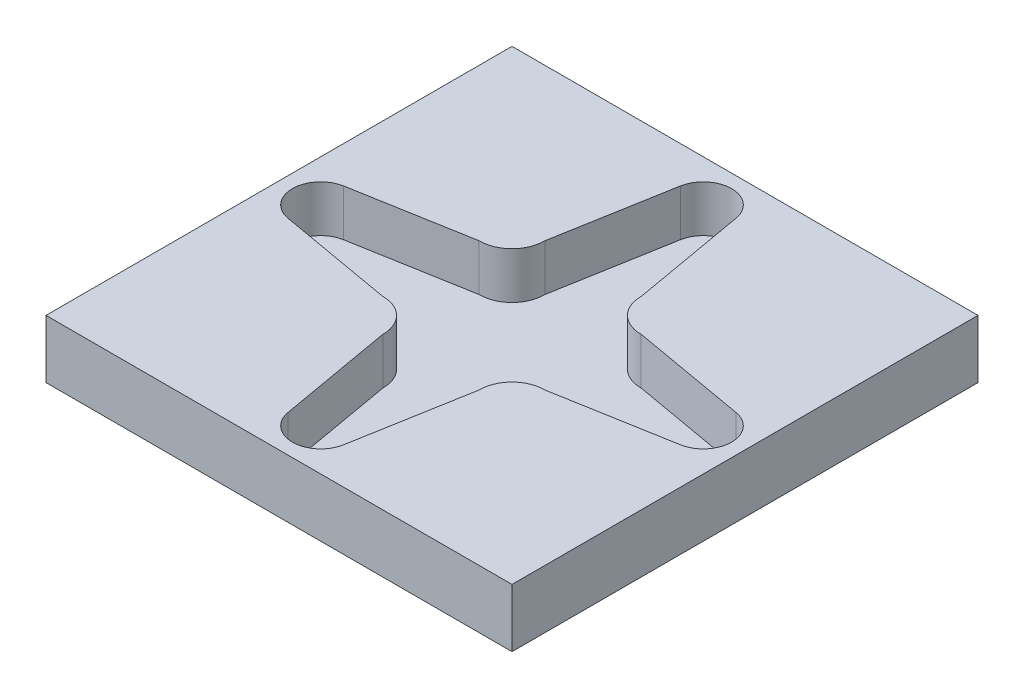
ISO-10303-21;
HEADER;
FILE_DESCRIPTION(('STEP AP214'),'2;1');
FILE_NAME('part.step','',(''),(''),'','','');
FILE_SCHEMA(('AUTOMOTIVE_DESIGN { 1 0 10303 214 1 1 1 1 }'));
ENDSEC;
DATA;
#1=APPLICATION_CONTEXT('core data for automotive mechanical design processes');
#2=APPLICATION_PROTOCOL_DEFINITION('international standard','automotive_design',2000,#1);
#3=PRODUCT_CONTEXT('',#1,'mechanical');
#4=PRODUCT('Part','Part','',(#3));
#5=PRODUCT_RELATED_PRODUCT_CATEGORY('part','',(#4));
#6=PRODUCT_DEFINITION_FORMATION('','',#4);
#7=PRODUCT_DEFINITION_CONTEXT('part definition',#1,'design');
#8=PRODUCT_DEFINITION('design','',#6,#7);
#9=PRODUCT_DEFINITION_SHAPE('','',#8);
#10=(LENGTH_UNIT() NAMED_UNIT(*) SI_UNIT(.MILLI.,.METRE.));
#11=(NAMED_UNIT(*) PLANE_ANGLE_UNIT() SI_UNIT($,.RADIAN.));
#12=(NAMED_UNIT(*) SI_UNIT($,.STERADIAN.) SOLID_ANGLE_UNIT());
#13=UNCERTAINTY_MEASURE_WITH_UNIT(LENGTH_MEASURE(1.E-05),#10,'distance_accuracy_value','');
#14=(GEOMETRIC_REPRESENTATION_CONTEXT(3) GLOBAL_UNCERTAINTY_ASSIGNED_CONTEXT((#13)) GLOBAL_UNIT_ASSIGNED_CONTEXT((#10,
#11,#12)) REPRESENTATION_CONTEXT('',''));
#15=CARTESIAN_POINT('',(0.,0.,0.));
#16=DIRECTION('',(0.,0.,1.));
#17=DIRECTION('',(1.,0.,0.));
#18=AXIS2_PLACEMENT_3D('',#15,#16,#17);
#19=CARTESIAN_POINT('',(0.,5.,0.));
#20=DIRECTION('',(0.,1.,0.));
#21=DIRECTION('',(0.,0.,1.));
#22=AXIS2_PLACEMENT_3D('',#19,#20,#21);
#23=PLANE('',#22);
#24=DIRECTION('',(-0.984807753012208,0.,0.173648177666932));
#25=VECTOR('',#24,1.);
#26=CARTESIAN_POINT('',(-6.95755421826345,5.,-4.13668710144533));
#27=LINE('',#26,#25);
#28=CARTESIAN_POINT('',(-6.95755421826345,5.00000000000001,-4.13668710144533));
#29=VERTEX_POINT('',#28);
#30=CARTESIAN_POINT('',(-16.8412600087122,5.00000000000001,-2.39392310120471));
#31=VERTEX_POINT('',#30);
#32=EDGE_CURVE('E300',#29,#31,#27,.T.);
#33=ORIENTED_EDGE('',*,*,#32,.F.);
#34=CARTESIAN_POINT('',(-6.92372320752341,5.,-6.92372320752326));
#35=DIRECTION('',(0.,1.,0.));
#36=DIRECTION('',(0.,0.,1.));
#37=AXIS2_PLACEMENT_3D('',#34,#35,#36);
#38=CIRCLE('',#37,2.78724143085412);
#39=CARTESIAN_POINT('',(-4.13668710144548,5.,-6.95755421826329));
#40=VERTEX_POINT('',#39);
#41=EDGE_CURVE('E303',#40,#29,#38,.F.);
#42=ORIENTED_EDGE('',*,*,#41,.F.);
#43=DIRECTION('',(-0.173648177666917,0.,0.98480775301221));
#44=VECTOR('',#43,1.);
#45=CARTESIAN_POINT('',(-2.393923101205,5.,-16.8412600087122));
#46=LINE('',#45,#44);
#47=CARTESIAN_POINT('',(-2.393923101205,5.,-16.8412600087122));
#48=VERTEX_POINT('',#47);
#49=EDGE_CURVE('E200',#48,#40,#46,.T.);
#50=ORIENTED_EDGE('',*,*,#49,.F.);
#51=CARTESIAN_POINT('',(-1.10097060438939E-13,5.,-16.4191467762285));
#52=DIRECTION('',(0.,1.,0.));
#53=DIRECTION('',(0.,0.,1.));
#54=AXIS2_PLACEMENT_3D('',#51,#52,#53);
#55=CIRCLE('',#54,2.43085322377149);
#56=CARTESIAN_POINT('',(2.39392310120477,5.00000000000001,-16.8412600087122));
#57=VERTEX_POINT('',#56);
#58=EDGE_CURVE('E261',#57,#48,#55,.T.);
#59=ORIENTED_EDGE('',*,*,#58,.F.);
#60=DIRECTION('',(-0.173648177666929,0.,-0.984807753012208));
#61=VECTOR('',#60,1.);
#62=CARTESIAN_POINT('',(4.13668710144536,5.,-6.95755421826344));
#63=LINE('',#62,#61);
#64=CARTESIAN_POINT('',(4.13668710144536,5.00000000000001,-6.95755421826344));
#65=VERTEX_POINT('',#64);
#66=EDGE_CURVE('E264',#65,#57,#63,.T.);
#67=ORIENTED_EDGE('',*,*,#66,.F.);
#68=CARTESIAN_POINT('',(6.92372320752328,5.,-6.92372320752338));
#69=DIRECTION('',(0.,1.,0.));
#70=DIRECTION('',(0.,0.,1.));
#71=AXIS2_PLACEMENT_3D('',#68,#69,#70);
#72=CIRCLE('',#71,2.78724143085411);
#73=CARTESIAN_POINT('',(6.95755421826331,5.00000000000001,-4.13668710144546));
#74=VERTEX_POINT('',#73);
#75=EDGE_CURVE('E267',#74,#65,#72,.F.);
#76=ORIENTED_EDGE('',*,*,#75,.F.);
#77=DIRECTION('',(-0.98480775301221,0.,-0.173648177666921));
#78=VECTOR('',#77,1.);
#79=CARTESIAN_POINT('',(16.8412600087122,5.,-2.39392310120494));
#80=LINE('',#79,#78);
#81=CARTESIAN_POINT('',(16.8412600087122,5.00000000000001,-2.39392310120494));
#82=VERTEX_POINT('',#81);
#83=EDGE_CURVE('E270',#82,#74,#80,.T.);
#84=ORIENTED_EDGE('',*,*,#83,.F.);
#85=CARTESIAN_POINT('',(16.4191467762285,5.,0.));
#86=DIRECTION('',(0.,1.,0.));
#87=DIRECTION('',(0.,0.,1.));
#88=AXIS2_PLACEMENT_3D('',#85,#86,#87);
#89=CIRCLE('',#88,2.43085322377149);
#90=CARTESIAN_POINT('',(16.8412600087122,5.00000000000001,2.39392310120483));
#91=VERTEX_POINT('',#90);
#92=EDGE_CURVE('E273',#91,#82,#89,.T.);
#93=ORIENTED_EDGE('',*,*,#92,.F.);
#94=DIRECTION('',(0.984807753012209,0.,-0.173648177666925));
#95=VECTOR('',#94,1.);
#96=CARTESIAN_POINT('',(6.95755421826342,5.,4.13668710144538));
#97=LINE('',#96,#95);
#98=CARTESIAN_POINT('',(6.95755421826343,5.00000000000001,4.13668710144538));
#99=VERTEX_POINT('',#98);
#100=EDGE_CURVE('E276',#99,#91,#97,.T.);
#101=ORIENTED_EDGE('',*,*,#100,.F.);
#102=CARTESIAN_POINT('',(6.92372320752336,5.,6.9237232075233));
#103=DIRECTION('',(0.,1.,0.));
#104=DIRECTION('',(0.,0.,1.));
#105=AXIS2_PLACEMENT_3D('',#102,#103,#104);
#106=CIRCLE('',#105,2.78724143085411);
#107=CARTESIAN_POINT('',(4.13668710144543,5.00000000000001,6.95755421826332));
#108=VERTEX_POINT('',#107);
#109=EDGE_CURVE('E279',#108,#99,#106,.F.);
#110=ORIENTED_EDGE('',*,*,#109,.F.);
#111=DIRECTION('',(0.173648177666924,0.,-0.984807753012209));
#112=VECTOR('',#111,1.);
#113=CARTESIAN_POINT('',(2.39392310120488,5.,16.8412600087122));
#114=LINE('',#113,#112);
#115=CARTESIAN_POINT('',(2.39392310120488,5.00000000000001,16.8412600087122));
#116=VERTEX_POINT('',#115);
#117=EDGE_CURVE('E282',#116,#108,#114,.T.);
#118=ORIENTED_EDGE('',*,*,#117,.F.);
#119=CARTESIAN_POINT('',(0.,5.,16.4191467762285));
#120=DIRECTION('',(0.,1.,0.));
#121=DIRECTION('',(0.,0.,1.));
#122=AXIS2_PLACEMENT_3D('',#119,#120,#121);
#123=CIRCLE('',#122,2.43085322377149);
#124=CARTESIAN_POINT('',(-2.39392310120489,5.00000000000001,16.8412600087122));
#125=VERTEX_POINT('',#124);
#126=EDGE_CURVE('E285',#125,#116,#123,.T.);
#127=ORIENTED_EDGE('',*,*,#126,.F.);
#128=DIRECTION('',(0.173648177666926,0.,0.984807753012209));
#129=VECTOR('',#128,1.);
#130=CARTESIAN_POINT('',(-4.13668710144547,5.,6.95755421826328));
#131=LINE('',#130,#129);
#132=CARTESIAN_POINT('',(-4.13668710144547,5.00000000000001,6.95755421826328));
#133=VERTEX_POINT('',#132);
#134=EDGE_CURVE('E288',#133,#125,#131,.T.);
#135=ORIENTED_EDGE('',*,*,#134,.F.);
#136=CARTESIAN_POINT('',(-6.92372320752333,5.,6.92372320752333));
#137=DIRECTION('',(0.,1.,0.));
#138=DIRECTION('',(0.,0.,1.));
#139=AXIS2_PLACEMENT_3D('',#136,#137,#138);
#140=CIRCLE('',#139,2.78724143085404);
#141=CARTESIAN_POINT('',(-6.95755421826341,5.00000000000001,4.13668710144548));
#142=VERTEX_POINT('',#141);
#143=EDGE_CURVE('E291',#142,#133,#140,.F.);
#144=ORIENTED_EDGE('',*,*,#143,.F.);
#145=DIRECTION('',(0.984807753012211,0.,0.173648177666914));
#146=VECTOR('',#145,1.);
#147=CARTESIAN_POINT('',(-16.8412600087122,5.,2.39392310120506));
#148=LINE('',#147,#146);
#149=CARTESIAN_POINT('',(-16.8412600087122,5.00000000000001,2.39392310120506));
#150=VERTEX_POINT('',#149);
#151=EDGE_CURVE('E294',#150,#142,#148,.T.);
#152=ORIENTED_EDGE('',*,*,#151,.F.);
#153=CARTESIAN_POINT('',(-16.4191467762285,5.,1.66737345962402E-13));
#154=DIRECTION('',(0.,1.,0.));
#155=DIRECTION('',(0.,0.,1.));
#156=AXIS2_PLACEMENT_3D('',#153,#154,#155);
#157=CIRCLE('',#156,2.43085322377149);
#158=EDGE_CURVE('E297',#31,#150,#157,.T.);
#159=ORIENTED_EDGE('',*,*,#158,.F.);
#160=EDGE_LOOP('',(#33,#42,#50,#59,#67,#76,#84,#93,#101,#110,#118,#127,#135,#144,#152,#159));
#161=FACE_BOUND('',#160,.T.);
#162=DIRECTION('',(1.,0.,0.));
#163=VECTOR('',#162,1.);
#164=CARTESIAN_POINT('',(-20.,5.,20.));
#165=LINE('',#164,#163);
#166=CARTESIAN_POINT('',(-20.,5.,20.));
#167=VERTEX_POINT('',#166);
#168=CARTESIAN_POINT('',(20.,5.,20.));
#169=VERTEX_POINT('',#168);
#170=EDGE_CURVE('E179',#167,#169,#165,.T.);
#171=ORIENTED_EDGE('',*,*,#170,.T.);
#172=DIRECTION('',(0.,0.,-1.));
#173=VECTOR('',#172,1.);
#174=CARTESIAN_POINT('',(20.,5.,20.));
#175=LINE('',#174,#173);
#176=CARTESIAN_POINT('',(20.,5.,-20.));
#177=VERTEX_POINT('',#176);
#178=EDGE_CURVE('E189',#169,#177,#175,.T.);
#179=ORIENTED_EDGE('',*,*,#178,.T.);
#180=DIRECTION('',(-1.,0.,0.));
#181=VECTOR('',#180,1.);
#182=CARTESIAN_POINT('',(-20.,5.,-20.));
#183=LINE('',#182,#181);
#184=CARTESIAN_POINT('',(-20.,5.,-20.));
#185=VERTEX_POINT('',#184);
#186=EDGE_CURVE('E187',#177,#185,#183,.T.);
#187=ORIENTED_EDGE('',*,*,#186,.T.);
#188=DIRECTION('',(0.,0.,1.));
#189=VECTOR('',#188,1.);
#190=CARTESIAN_POINT('',(-20.,5.,20.));
#191=LINE('',#190,#189);
#192=EDGE_CURVE('E48',#185,#167,#191,.T.);
#193=ORIENTED_EDGE('',*,*,#192,.T.);
#194=EDGE_LOOP('',(#171,#179,#187,#193));
#195=FACE_BOUND('',#194,.T.);
#196=ADVANCED_FACE('F33',(#161,#195),#23,.T.);
#197=CARTESIAN_POINT('',(0.,0.999999999999999,16.4191467762285));
#198=DIRECTION('',(0.,-1.,0.));
#199=DIRECTION('',(0.,0.,-1.));
#200=AXIS2_PLACEMENT_3D('',#197,#198,#199);
#201=PLANE('',#200);
#202=CARTESIAN_POINT('',(-6.92372320752341,0.999999999999999,-6.92372320752326));
#203=DIRECTION('',(0.,-1.,0.));
#204=DIRECTION('',(-1.,0.,0.));
#205=AXIS2_PLACEMENT_3D('',#202,#203,#204);
#206=CIRCLE('',#205,2.78724143085412);
#207=CARTESIAN_POINT('',(-4.13668710144548,0.999999999999999,-6.95755421826329));
#208=VERTEX_POINT('',#207);
#209=CARTESIAN_POINT('',(-6.95755421826345,0.999999999999999,-4.13668710144533));
#210=VERTEX_POINT('',#209);
#211=EDGE_CURVE('E258',#208,#210,#206,.T.);
#212=ORIENTED_EDGE('',*,*,#211,.T.);
#213=DIRECTION('',(-0.984807753012208,0.,0.173648177666932));
#214=VECTOR('',#213,1.);
#215=CARTESIAN_POINT('',(-6.95755421826345,0.999999999999999,-4.13668710144533));
#216=LINE('',#215,#214);
#217=CARTESIAN_POINT('',(-16.8412600087122,0.999999999999999,-2.39392310120471));
#218=VERTEX_POINT('',#217);
#219=EDGE_CURVE('E254',#210,#218,#216,.T.);
#220=ORIENTED_EDGE('',*,*,#219,.T.);
#221=CARTESIAN_POINT('',(-16.4191467762285,0.999999999999999,1.66737345962402E-13));
#222=DIRECTION('',(0.,1.,0.));
#223=DIRECTION('',(-1.,0.,0.));
#224=AXIS2_PLACEMENT_3D('',#221,#222,#223);
#225=CIRCLE('',#224,2.43085322377149);
#226=CARTESIAN_POINT('',(-16.8412600087122,0.999999999999999,2.39392310120506));
#227=VERTEX_POINT('',#226);
#228=EDGE_CURVE('E250',#218,#227,#225,.T.);
#229=ORIENTED_EDGE('',*,*,#228,.T.);
#230=DIRECTION('',(0.984807753012211,0.,0.173648177666914));
#231=VECTOR('',#230,1.);
#232=CARTESIAN_POINT('',(-16.8412600087122,0.999999999999999,2.39392310120506));
#233=LINE('',#232,#231);
#234=CARTESIAN_POINT('',(-6.95755421826341,0.999999999999999,4.13668710144548));
#235=VERTEX_POINT('',#234);
#236=EDGE_CURVE('E246',#227,#235,#233,.T.);
#237=ORIENTED_EDGE('',*,*,#236,.T.);
#238=CARTESIAN_POINT('',(-6.92372320752333,0.999999999999999,6.92372320752333));
#239=DIRECTION('',(0.,-1.,0.));
#240=DIRECTION('',(-1.,0.,0.));
#241=AXIS2_PLACEMENT_3D('',#238,#239,#240);
#242=CIRCLE('',#241,2.78724143085404);
#243=CARTESIAN_POINT('',(-4.13668710144547,0.999999999999999,6.95755421826328));
#244=VERTEX_POINT('',#243);
#245=EDGE_CURVE('E242',#235,#244,#242,.T.);
#246=ORIENTED_EDGE('',*,*,#245,.T.);
#247=DIRECTION('',(0.173648177666926,0.,0.984807753012209));
#248=VECTOR('',#247,1.);
#249=CARTESIAN_POINT('',(-4.13668710144547,0.999999999999999,6.95755421826328));
#250=LINE('',#249,#248);
#251=CARTESIAN_POINT('',(-2.39392310120489,0.999999999999999,16.8412600087122));
#252=VERTEX_POINT('',#251);
#253=EDGE_CURVE('E238',#244,#252,#250,.T.);
#254=ORIENTED_EDGE('',*,*,#253,.T.);
#255=CARTESIAN_POINT('',(0.,0.999999999999999,16.4191467762285));
#256=DIRECTION('',(0.,1.,0.));
#257=DIRECTION('',(-1.,0.,0.));
#258=AXIS2_PLACEMENT_3D('',#255,#256,#257);
#259=CIRCLE('',#258,2.43085322377149);
#260=CARTESIAN_POINT('',(2.39392310120488,0.999999999999999,16.8412600087122));
#261=VERTEX_POINT('',#260);
#262=EDGE_CURVE('E234',#252,#261,#259,.T.);
#263=ORIENTED_EDGE('',*,*,#262,.T.);
#264=DIRECTION('',(0.173648177666924,0.,-0.984807753012209));
#265=VECTOR('',#264,1.);
#266=CARTESIAN_POINT('',(2.39392310120488,0.999999999999999,16.8412600087122));
#267=LINE('',#266,#265);
#268=CARTESIAN_POINT('',(4.13668710144543,0.999999999999999,6.95755421826332));
#269=VERTEX_POINT('',#268);
#270=EDGE_CURVE('E230',#261,#269,#267,.T.);
#271=ORIENTED_EDGE('',*,*,#270,.T.);
#272=CARTESIAN_POINT('',(6.92372320752336,0.999999999999999,6.9237232075233));
#273=DIRECTION('',(0.,-1.,0.));
#274=DIRECTION('',(-1.,0.,0.));
#275=AXIS2_PLACEMENT_3D('',#272,#273,#274);
#276=CIRCLE('',#275,2.78724143085411);
#277=CARTESIAN_POINT('',(6.95755421826343,0.999999999999999,4.13668710144538));
#278=VERTEX_POINT('',#277);
#279=EDGE_CURVE('E226',#269,#278,#276,.T.);
#280=ORIENTED_EDGE('',*,*,#279,.T.);
#281=DIRECTION('',(0.984807753012209,0.,-0.173648177666925));
#282=VECTOR('',#281,1.);
#283=CARTESIAN_POINT('',(6.95755421826342,0.999999999999999,4.13668710144538));
#284=LINE('',#283,#282);
#285=CARTESIAN_POINT('',(16.8412600087122,0.999999999999999,2.39392310120483));
#286=VERTEX_POINT('',#285);
#287=EDGE_CURVE('E222',#278,#286,#284,.T.);
#288=ORIENTED_EDGE('',*,*,#287,.T.);
#289=CARTESIAN_POINT('',(16.4191467762285,0.999999999999999,0.));
#290=DIRECTION('',(0.,1.,0.));
#291=DIRECTION('',(-1.,0.,0.));
#292=AXIS2_PLACEMENT_3D('',#289,#290,#291);
#293=CIRCLE('',#292,2.43085322377149);
#294=CARTESIAN_POINT('',(16.8412600087122,0.999999999999999,-2.39392310120494));
#295=VERTEX_POINT('',#294);
#296=EDGE_CURVE('E218',#286,#295,#293,.T.);
#297=ORIENTED_EDGE('',*,*,#296,.T.);
#298=DIRECTION('',(-0.98480775301221,0.,-0.173648177666921));
#299=VECTOR('',#298,1.);
#300=CARTESIAN_POINT('',(16.8412600087122,0.999999999999999,-2.39392310120494));
#301=LINE('',#300,#299);
#302=CARTESIAN_POINT('',(6.95755421826331,0.999999999999999,-4.13668710144546));
#303=VERTEX_POINT('',#302);
#304=EDGE_CURVE('E214',#295,#303,#301,.T.);
#305=ORIENTED_EDGE('',*,*,#304,.T.);
#306=CARTESIAN_POINT('',(6.92372320752328,0.999999999999999,-6.92372320752338));
#307=DIRECTION('',(0.,-1.,0.));
#308=DIRECTION('',(-1.,0.,0.));
#309=AXIS2_PLACEMENT_3D('',#306,#307,#308);
#310=CIRCLE('',#309,2.78724143085411);
#311=CARTESIAN_POINT('',(4.13668710144536,0.999999999999999,-6.95755421826344));
#312=VERTEX_POINT('',#311);
#313=EDGE_CURVE('E210',#303,#312,#310,.T.);
#314=ORIENTED_EDGE('',*,*,#313,.T.);
#315=DIRECTION('',(-0.173648177666929,0.,-0.984807753012208));
#316=VECTOR('',#315,1.);
#317=CARTESIAN_POINT('',(4.13668710144536,0.999999999999999,-6.95755421826344));
#318=LINE('',#317,#316);
#319=CARTESIAN_POINT('',(2.39392310120477,0.999999999999999,-16.8412600087122));
#320=VERTEX_POINT('',#319);
#321=EDGE_CURVE('E206',#312,#320,#318,.T.);
#322=ORIENTED_EDGE('',*,*,#321,.T.);
#323=CARTESIAN_POINT('',(-1.10097060438939E-13,0.999999999999999,-16.4191467762285));
#324=DIRECTION('',(0.,1.,0.));
#325=DIRECTION('',(-1.,0.,0.));
#326=AXIS2_PLACEMENT_3D('',#323,#324,#325);
#327=CIRCLE('',#326,2.43085322377149);
#328=CARTESIAN_POINT('',(-2.393923101205,0.999999999999999,-16.8412600087122));
#329=VERTEX_POINT('',#328);
#330=EDGE_CURVE('E202',#320,#329,#327,.T.);
#331=ORIENTED_EDGE('',*,*,#330,.T.);
#332=DIRECTION('',(-0.173648177666917,0.,0.98480775301221));
#333=VECTOR('',#332,1.);
#334=CARTESIAN_POINT('',(-2.393923101205,0.999999999999999,-16.8412600087122));
#335=LINE('',#334,#333);
#336=EDGE_CURVE('E197',#329,#208,#335,.T.);
#337=ORIENTED_EDGE('',*,*,#336,.T.);
#338=EDGE_LOOP('',(#212,#220,#229,#237,#246,#254,#263,#271,#280,#288,#297,#305,#314,#322,#331,#337));
#339=FACE_BOUND('',#338,.T.);
#340=ADVANCED_FACE('F340',(#339),#201,.F.);
#341=CARTESIAN_POINT('',(-6.92372320752341,58.3158513014656,-6.92372320752326));
#342=DIRECTION('',(0.,-1.,0.));
#343=DIRECTION('',(1.,0.,0.));
#344=AXIS2_PLACEMENT_3D('',#341,#342,#343);
#345=CYLINDRICAL_SURFACE('',#344,2.78724143085412);
#346=ORIENTED_EDGE('',*,*,#41,.T.);
#347=DIRECTION('',(0.,-1.,0.));
#348=VECTOR('',#347,1.);
#349=CARTESIAN_POINT('',(-6.95755421826345,58.3158513014656,-4.13668710144533));
#350=LINE('',#349,#348);
#351=EDGE_CURVE('E257',#29,#210,#350,.T.);
#352=ORIENTED_EDGE('',*,*,#351,.T.);
#353=ORIENTED_EDGE('',*,*,#211,.F.);
#354=DIRECTION('',(0.,-1.,0.));
#355=VECTOR('',#354,1.);
#356=CARTESIAN_POINT('',(-4.13668710144548,58.3158513014656,-6.95755421826329));
#357=LINE('',#356,#355);
#358=EDGE_CURVE('E193',#40,#208,#357,.T.);
#359=ORIENTED_EDGE('',*,*,#358,.F.);
#360=EDGE_LOOP('',(#346,#352,#353,#359));
#361=FACE_BOUND('',#360,.T.);
#362=ADVANCED_FACE('F347',(#361),#345,.T.);
#363=CARTESIAN_POINT('',(-6.95755421826345,58.3158513014656,-4.13668710144533));
#364=DIRECTION('',(0.173648177666932,0.,0.984807753012208));
#365=DIRECTION('',(0.984807753012208,0.,-0.173648177666932));
#366=AXIS2_PLACEMENT_3D('',#363,#364,#365);
#367=PLANE('',#366);
#368=ORIENTED_EDGE('',*,*,#32,.T.);
#369=DIRECTION('',(0.,-1.,0.));
#370=VECTOR('',#369,1.);
#371=CARTESIAN_POINT('',(-16.8412600087122,58.3158513014656,-2.39392310120471));
#372=LINE('',#371,#370);
#373=EDGE_CURVE('E253',#31,#218,#372,.T.);
#374=ORIENTED_EDGE('',*,*,#373,.T.);
#375=ORIENTED_EDGE('',*,*,#219,.F.);
#376=ORIENTED_EDGE('',*,*,#351,.F.);
#377=EDGE_LOOP('',(#368,#374,#375,#376));
#378=FACE_BOUND('',#377,.T.);
#379=ADVANCED_FACE('F354',(#378),#367,.T.);
#380=CARTESIAN_POINT('',(-16.4191467762285,58.3158513014656,1.66737345962402E-13));
#381=DIRECTION('',(0.,-1.,0.));
#382=DIRECTION('',(1.,0.,0.));
#383=AXIS2_PLACEMENT_3D('',#380,#381,#382);
#384=CYLINDRICAL_SURFACE('',#383,2.43085322377149);
#385=ORIENTED_EDGE('',*,*,#158,.T.);
#386=DIRECTION('',(0.,-1.,0.));
#387=VECTOR('',#386,1.);
#388=CARTESIAN_POINT('',(-16.8412600087122,58.3158513014656,2.39392310120506));
#389=LINE('',#388,#387);
#390=EDGE_CURVE('E249',#150,#227,#389,.T.);
#391=ORIENTED_EDGE('',*,*,#390,.T.);
#392=ORIENTED_EDGE('',*,*,#228,.F.);
#393=ORIENTED_EDGE('',*,*,#373,.F.);
#394=EDGE_LOOP('',(#385,#391,#392,#393));
#395=FACE_BOUND('',#394,.T.);
#396=ADVANCED_FACE('F358',(#395),#384,.F.);
#397=CARTESIAN_POINT('',(-16.8412600087122,58.3158513014656,2.39392310120506));
#398=DIRECTION('',(0.173648177666914,0.,-0.984807753012211));
#399=DIRECTION('',(-0.984807753012211,0.,-0.173648177666914));
#400=AXIS2_PLACEMENT_3D('',#397,#398,#399);
#401=PLANE('',#400);
#402=ORIENTED_EDGE('',*,*,#151,.T.);
#403=DIRECTION('',(0.,-1.,0.));
#404=VECTOR('',#403,1.);
#405=CARTESIAN_POINT('',(-6.95755421826341,58.3158513014656,4.13668710144548));
#406=LINE('',#405,#404);
#407=EDGE_CURVE('E245',#142,#235,#406,.T.);
#408=ORIENTED_EDGE('',*,*,#407,.T.);
#409=ORIENTED_EDGE('',*,*,#236,.F.);
#410=ORIENTED_EDGE('',*,*,#390,.F.);
#411=EDGE_LOOP('',(#402,#408,#409,#410));
#412=FACE_BOUND('',#411,.T.);
#413=ADVANCED_FACE('F362',(#412),#401,.T.);
#414=CARTESIAN_POINT('',(-6.92372320752333,58.3158513014656,6.92372320752333));
#415=DIRECTION('',(0.,-1.,0.));
#416=DIRECTION('',(1.,0.,0.));
#417=AXIS2_PLACEMENT_3D('',#414,#415,#416);
#418=CYLINDRICAL_SURFACE('',#417,2.78724143085404);
#419=ORIENTED_EDGE('',*,*,#143,.T.);
#420=DIRECTION('',(0.,-1.,0.));
#421=VECTOR('',#420,1.);
#422=CARTESIAN_POINT('',(-4.13668710144547,58.3158513014656,6.95755421826328));
#423=LINE('',#422,#421);
#424=EDGE_CURVE('E241',#133,#244,#423,.T.);
#425=ORIENTED_EDGE('',*,*,#424,.T.);
#426=ORIENTED_EDGE('',*,*,#245,.F.);
#427=ORIENTED_EDGE('',*,*,#407,.F.);
#428=EDGE_LOOP('',(#419,#425,#426,#427));
#429=FACE_BOUND('',#428,.T.);
#430=ADVANCED_FACE('F366',(#429),#418,.T.);
#431=CARTESIAN_POINT('',(-4.13668710144547,58.3158513014656,6.95755421826328));
#432=DIRECTION('',(0.984807753012209,0.,-0.173648177666926));
#433=DIRECTION('',(-0.173648177666926,0.,-0.984807753012209));
#434=AXIS2_PLACEMENT_3D('',#431,#432,#433);
#435=PLANE('',#434);
#436=ORIENTED_EDGE('',*,*,#134,.T.);
#437=DIRECTION('',(0.,-1.,0.));
#438=VECTOR('',#437,1.);
#439=CARTESIAN_POINT('',(-2.39392310120489,58.3158513014656,16.8412600087122));
#440=LINE('',#439,#438);
#441=EDGE_CURVE('E237',#125,#252,#440,.T.);
#442=ORIENTED_EDGE('',*,*,#441,.T.);
#443=ORIENTED_EDGE('',*,*,#253,.F.);
#444=ORIENTED_EDGE('',*,*,#424,.F.);
#445=EDGE_LOOP('',(#436,#442,#443,#444));
#446=FACE_BOUND('',#445,.T.);
#447=ADVANCED_FACE('F370',(#446),#435,.T.);
#448=CARTESIAN_POINT('',(0.,58.3158513014656,16.4191467762285));
#449=DIRECTION('',(0.,-1.,0.));
#450=DIRECTION('',(1.,0.,0.));
#451=AXIS2_PLACEMENT_3D('',#448,#449,#450);
#452=CYLINDRICAL_SURFACE('',#451,2.43085322377149);
#453=ORIENTED_EDGE('',*,*,#126,.T.);
#454=DIRECTION('',(0.,-1.,0.));
#455=VECTOR('',#454,1.);
#456=CARTESIAN_POINT('',(2.39392310120488,58.3158513014656,16.8412600087122));
#457=LINE('',#456,#455);
#458=EDGE_CURVE('E233',#116,#261,#457,.T.);
#459=ORIENTED_EDGE('',*,*,#458,.T.);
#460=ORIENTED_EDGE('',*,*,#262,.F.);
#461=ORIENTED_EDGE('',*,*,#441,.F.);
#462=EDGE_LOOP('',(#453,#459,#460,#461));
#463=FACE_BOUND('',#462,.T.);
#464=ADVANCED_FACE('F374',(#463),#452,.F.);
#465=CARTESIAN_POINT('',(2.39392310120488,58.3158513014656,16.8412600087122));
#466=DIRECTION('',(-0.984807753012209,0.,-0.173648177666924));
#467=DIRECTION('',(-0.173648177666924,0.,0.984807753012209));
#468=AXIS2_PLACEMENT_3D('',#465,#466,#467);
#469=PLANE('',#468);
#470=ORIENTED_EDGE('',*,*,#117,.T.);
#471=DIRECTION('',(0.,-1.,0.));
#472=VECTOR('',#471,1.);
#473=CARTESIAN_POINT('',(4.13668710144543,58.3158513014656,6.95755421826332));
#474=LINE('',#473,#472);
#475=EDGE_CURVE('E229',#108,#269,#474,.T.);
#476=ORIENTED_EDGE('',*,*,#475,.T.);
#477=ORIENTED_EDGE('',*,*,#270,.F.);
#478=ORIENTED_EDGE('',*,*,#458,.F.);
#479=EDGE_LOOP('',(#470,#476,#477,#478));
#480=FACE_BOUND('',#479,.T.);
#481=ADVANCED_FACE('F378',(#480),#469,.T.);
#482=CARTESIAN_POINT('',(6.92372320752336,58.3158513014656,6.9237232075233));
#483=DIRECTION('',(0.,-1.,0.));
#484=DIRECTION('',(1.,0.,0.));
#485=AXIS2_PLACEMENT_3D('',#482,#483,#484);
#486=CYLINDRICAL_SURFACE('',#485,2.78724143085411);
#487=ORIENTED_EDGE('',*,*,#109,.T.);
#488=DIRECTION('',(0.,-1.,0.));
#489=VECTOR('',#488,1.);
#490=CARTESIAN_POINT('',(6.95755421826343,58.3158513014656,4.13668710144538));
#491=LINE('',#490,#489);
#492=EDGE_CURVE('E225',#99,#278,#491,.T.);
#493=ORIENTED_EDGE('',*,*,#492,.T.);
#494=ORIENTED_EDGE('',*,*,#279,.F.);
#495=ORIENTED_EDGE('',*,*,#475,.F.);
#496=EDGE_LOOP('',(#487,#493,#494,#495));
#497=FACE_BOUND('',#496,.T.);
#498=ADVANCED_FACE('F382',(#497),#486,.T.);
#499=CARTESIAN_POINT('',(6.95755421826342,58.3158513014656,4.13668710144538));
#500=DIRECTION('',(-0.173648177666925,0.,-0.984807753012209));
#501=DIRECTION('',(-0.984807753012209,0.,0.173648177666925));
#502=AXIS2_PLACEMENT_3D('',#499,#500,#501);
#503=PLANE('',#502);
#504=ORIENTED_EDGE('',*,*,#100,.T.);
#505=DIRECTION('',(0.,-1.,0.));
#506=VECTOR('',#505,1.);
#507=CARTESIAN_POINT('',(16.8412600087122,58.3158513014656,2.39392310120483));
#508=LINE('',#507,#506);
#509=EDGE_CURVE('E221',#91,#286,#508,.T.);
#510=ORIENTED_EDGE('',*,*,#509,.T.);
#511=ORIENTED_EDGE('',*,*,#287,.F.);
#512=ORIENTED_EDGE('',*,*,#492,.F.);
#513=EDGE_LOOP('',(#504,#510,#511,#512));
#514=FACE_BOUND('',#513,.T.);
#515=ADVANCED_FACE('F386',(#514),#503,.T.);
#516=CARTESIAN_POINT('',(16.4191467762285,58.3158513014656,0.));
#517=DIRECTION('',(0.,-1.,0.));
#518=DIRECTION('',(1.,0.,0.));
#519=AXIS2_PLACEMENT_3D('',#516,#517,#518);
#520=CYLINDRICAL_SURFACE('',#519,2.43085322377149);
#521=ORIENTED_EDGE('',*,*,#92,.T.);
#522=DIRECTION('',(0.,-1.,0.));
#523=VECTOR('',#522,1.);
#524=CARTESIAN_POINT('',(16.8412600087122,58.3158513014656,-2.39392310120494));
#525=LINE('',#524,#523);
#526=EDGE_CURVE('E217',#82,#295,#525,.T.);
#527=ORIENTED_EDGE('',*,*,#526,.T.);
#528=ORIENTED_EDGE('',*,*,#296,.F.);
#529=ORIENTED_EDGE('',*,*,#509,.F.);
#530=EDGE_LOOP('',(#521,#527,#528,#529));
#531=FACE_BOUND('',#530,.T.);
#532=ADVANCED_FACE('F390',(#531),#520,.F.);
#533=CARTESIAN_POINT('',(16.8412600087122,58.3158513014656,-2.39392310120494));
#534=DIRECTION('',(-0.173648177666921,0.,0.98480775301221));
#535=DIRECTION('',(0.98480775301221,0.,0.173648177666921));
#536=AXIS2_PLACEMENT_3D('',#533,#534,#535);
#537=PLANE('',#536);
#538=ORIENTED_EDGE('',*,*,#83,.T.);
#539=DIRECTION('',(0.,-1.,0.));
#540=VECTOR('',#539,1.);
#541=CARTESIAN_POINT('',(6.95755421826331,58.3158513014656,-4.13668710144546));
#542=LINE('',#541,#540);
#543=EDGE_CURVE('E213',#74,#303,#542,.T.);
#544=ORIENTED_EDGE('',*,*,#543,.T.);
#545=ORIENTED_EDGE('',*,*,#304,.F.);
#546=ORIENTED_EDGE('',*,*,#526,.F.);
#547=EDGE_LOOP('',(#538,#544,#545,#546));
#548=FACE_BOUND('',#547,.T.);
#549=ADVANCED_FACE('F394',(#548),#537,.T.);
#550=CARTESIAN_POINT('',(6.92372320752328,58.3158513014656,-6.92372320752338));
#551=DIRECTION('',(0.,-1.,0.));
#552=DIRECTION('',(1.,0.,0.));
#553=AXIS2_PLACEMENT_3D('',#550,#551,#552);
#554=CYLINDRICAL_SURFACE('',#553,2.78724143085411);
#555=ORIENTED_EDGE('',*,*,#75,.T.);
#556=DIRECTION('',(0.,-1.,0.));
#557=VECTOR('',#556,1.);
#558=CARTESIAN_POINT('',(4.13668710144536,58.3158513014656,-6.95755421826344));
#559=LINE('',#558,#557);
#560=EDGE_CURVE('E209',#65,#312,#559,.T.);
#561=ORIENTED_EDGE('',*,*,#560,.T.);
#562=ORIENTED_EDGE('',*,*,#313,.F.);
#563=ORIENTED_EDGE('',*,*,#543,.F.);
#564=EDGE_LOOP('',(#555,#561,#562,#563));
#565=FACE_BOUND('',#564,.T.);
#566=ADVANCED_FACE('F398',(#565),#554,.T.);
#567=CARTESIAN_POINT('',(4.13668710144536,58.3158513014656,-6.95755421826344));
#568=DIRECTION('',(-0.984807753012208,0.,0.173648177666929));
#569=DIRECTION('',(0.173648177666929,0.,0.984807753012208));
#570=AXIS2_PLACEMENT_3D('',#567,#568,#569);
#571=PLANE('',#570);
#572=ORIENTED_EDGE('',*,*,#66,.T.);
#573=DIRECTION('',(0.,-1.,0.));
#574=VECTOR('',#573,1.);
#575=CARTESIAN_POINT('',(2.39392310120477,58.3158513014656,-16.8412600087122));
#576=LINE('',#575,#574);
#577=EDGE_CURVE('E205',#57,#320,#576,.T.);
#578=ORIENTED_EDGE('',*,*,#577,.T.);
#579=ORIENTED_EDGE('',*,*,#321,.F.);
#580=ORIENTED_EDGE('',*,*,#560,.F.);
#581=EDGE_LOOP('',(#572,#578,#579,#580));
#582=FACE_BOUND('',#581,.T.);
#583=ADVANCED_FACE('F402',(#582),#571,.T.);
#584=CARTESIAN_POINT('',(-1.10097060438939E-13,58.3158513014656,-16.4191467762285));
#585=DIRECTION('',(0.,-1.,0.));
#586=DIRECTION('',(1.,0.,0.));
#587=AXIS2_PLACEMENT_3D('',#584,#585,#586);
#588=CYLINDRICAL_SURFACE('',#587,2.43085322377149);
#589=ORIENTED_EDGE('',*,*,#58,.T.);
#590=DIRECTION('',(0.,-1.,0.));
#591=VECTOR('',#590,1.);
#592=CARTESIAN_POINT('',(-2.393923101205,58.3158513014656,-16.8412600087122));
#593=LINE('',#592,#591);
#594=EDGE_CURVE('E201',#48,#329,#593,.T.);
#595=ORIENTED_EDGE('',*,*,#594,.T.);
#596=ORIENTED_EDGE('',*,*,#330,.F.);
#597=ORIENTED_EDGE('',*,*,#577,.F.);
#598=EDGE_LOOP('',(#589,#595,#596,#597));
#599=FACE_BOUND('',#598,.T.);
#600=ADVANCED_FACE('F406',(#599),#588,.F.);
#601=CARTESIAN_POINT('',(-2.393923101205,58.3158513014656,-16.8412600087122));
#602=DIRECTION('',(0.98480775301221,0.,0.173648177666917));
#603=DIRECTION('',(0.173648177666917,0.,-0.98480775301221));
#604=AXIS2_PLACEMENT_3D('',#601,#602,#603);
#605=PLANE('',#604);
#606=ORIENTED_EDGE('',*,*,#49,.T.);
#607=ORIENTED_EDGE('',*,*,#358,.T.);
#608=ORIENTED_EDGE('',*,*,#336,.F.);
#609=ORIENTED_EDGE('',*,*,#594,.F.);
#610=EDGE_LOOP('',(#606,#607,#608,#609));
#611=FACE_BOUND('',#610,.T.);
#612=ADVANCED_FACE('F410',(#611),#605,.T.);
#613=CARTESIAN_POINT('',(20.,-5.,20.));
#614=DIRECTION('',(1.,0.,0.));
#615=DIRECTION('',(0.,0.,-1.));
#616=AXIS2_PLACEMENT_3D('',#613,#614,#615);
#617=PLANE('',#616);
#618=DIRECTION('',(0.,0.,-1.));
#619=VECTOR('',#618,1.);
#620=CARTESIAN_POINT('',(20.,0.,0.));
#621=LINE('',#620,#619);
#622=CARTESIAN_POINT('',(20.,0.,20.));
#623=VERTEX_POINT('',#622);
#624=CARTESIAN_POINT('',(20.,0.,-20.));
#625=VERTEX_POINT('',#624);
#626=EDGE_CURVE('E11',#623,#625,#621,.T.);
#627=ORIENTED_EDGE('',*,*,#626,.T.);
#628=DIRECTION('',(0.,1.,0.));
#629=VECTOR('',#628,1.);
#630=CARTESIAN_POINT('',(20.,-5.,-20.));
#631=LINE('',#630,#629);
#632=EDGE_CURVE('E56',#625,#177,#631,.T.);
#633=ORIENTED_EDGE('',*,*,#632,.T.);
#634=ORIENTED_EDGE('',*,*,#178,.F.);
#635=DIRECTION('',(0.,1.,0.));
#636=VECTOR('',#635,1.);
#637=CARTESIAN_POINT('',(20.,-5.,20.));
#638=LINE('',#637,#636);
#639=EDGE_CURVE('E175',#623,#169,#638,.T.);
#640=ORIENTED_EDGE('',*,*,#639,.F.);
#641=EDGE_LOOP('',(#627,#633,#634,#640));
#642=FACE_BOUND('',#641,.T.);
#643=ADVANCED_FACE('F328',(#642),#617,.T.);
#644=CARTESIAN_POINT('',(-20.,-5.,20.));
#645=DIRECTION('',(0.,0.,1.));
#646=DIRECTION('',(1.,0.,0.));
#647=AXIS2_PLACEMENT_3D('',#644,#645,#646);
#648=PLANE('',#647);
#649=DIRECTION('',(1.,0.,0.));
#650=VECTOR('',#649,1.);
#651=CARTESIAN_POINT('',(0.,0.,20.));
#652=LINE('',#651,#650);
#653=CARTESIAN_POINT('',(-20.,0.,20.));
#654=VERTEX_POINT('',#653);
#655=EDGE_CURVE('E41',#654,#623,#652,.T.);
#656=ORIENTED_EDGE('',*,*,#655,.T.);
#657=ORIENTED_EDGE('',*,*,#639,.T.);
#658=ORIENTED_EDGE('',*,*,#170,.F.);
#659=DIRECTION('',(0.,1.,0.));
#660=VECTOR('',#659,1.);
#661=CARTESIAN_POINT('',(-20.,-5.,20.));
#662=LINE('',#661,#660);
#663=EDGE_CURVE('E168',#654,#167,#662,.T.);
#664=ORIENTED_EDGE('',*,*,#663,.F.);
#665=EDGE_LOOP('',(#656,#657,#658,#664));
#666=FACE_BOUND('',#665,.T.);
#667=ADVANCED_FACE('F180',(#666),#648,.T.);
#668=CARTESIAN_POINT('',(-20.,-5.,20.));
#669=DIRECTION('',(-1.,0.,0.));
#670=DIRECTION('',(0.,0.,1.));
#671=AXIS2_PLACEMENT_3D('',#668,#669,#670);
#672=PLANE('',#671);
#673=DIRECTION('',(0.,0.,1.));
#674=VECTOR('',#673,1.);
#675=CARTESIAN_POINT('',(-20.,0.,0.));
#676=LINE('',#675,#674);
#677=CARTESIAN_POINT('',(-20.,0.,-20.));
#678=VERTEX_POINT('',#677);
#679=EDGE_CURVE('E172',#678,#654,#676,.T.);
#680=ORIENTED_EDGE('',*,*,#679,.T.);
#681=ORIENTED_EDGE('',*,*,#663,.T.);
#682=ORIENTED_EDGE('',*,*,#192,.F.);
#683=DIRECTION('',(0.,1.,0.));
#684=VECTOR('',#683,1.);
#685=CARTESIAN_POINT('',(-20.,-5.,-20.));
#686=LINE('',#685,#684);
#687=EDGE_CURVE('E176',#678,#185,#686,.T.);
#688=ORIENTED_EDGE('',*,*,#687,.F.);
#689=EDGE_LOOP('',(#680,#681,#682,#688));
#690=FACE_BOUND('',#689,.T.);
#691=ADVANCED_FACE('F170',(#690),#672,.T.);
#692=CARTESIAN_POINT('',(-20.,-5.,-20.));
#693=DIRECTION('',(0.,0.,-1.));
#694=DIRECTION('',(-1.,0.,0.));
#695=AXIS2_PLACEMENT_3D('',#692,#693,#694);
#696=PLANE('',#695);
#697=DIRECTION('',(-1.,0.,0.));
#698=VECTOR('',#697,1.);
#699=CARTESIAN_POINT('',(0.,0.,-20.));
#700=LINE('',#699,#698);
#701=EDGE_CURVE('E263',#625,#678,#700,.T.);
#702=ORIENTED_EDGE('',*,*,#701,.T.);
#703=ORIENTED_EDGE('',*,*,#687,.T.);
#704=ORIENTED_EDGE('',*,*,#186,.F.);
#705=ORIENTED_EDGE('',*,*,#632,.F.);
#706=EDGE_LOOP('',(#702,#703,#704,#705));
#707=FACE_BOUND('',#706,.T.);
#708=ADVANCED_FACE('F330',(#707),#696,.T.);
#709=CARTESIAN_POINT('',(0.,0.,0.));
#710=DIRECTION('',(0.,1.,0.));
#711=DIRECTION('',(0.,0.,1.));
#712=AXIS2_PLACEMENT_3D('',#709,#710,#711);
#713=PLANE('',#712);
#714=ORIENTED_EDGE('',*,*,#626,.F.);
#715=ORIENTED_EDGE('',*,*,#655,.F.);
#716=ORIENTED_EDGE('',*,*,#679,.F.);
#717=ORIENTED_EDGE('',*,*,#701,.F.);
#718=EDGE_LOOP('',(#714,#715,#716,#717));
#719=FACE_BOUND('',#718,.T.);
#720=ADVANCED_FACE('F35',(#719),#713,.F.);
#721=CLOSED_SHELL('',(#196,#340,#362,#379,#396,#413,#430,#447,#464,#481,#498,#515,#532,#549,
#566,#583,#600,#612,#643,#667,#691,#708,#720));
#722=MANIFOLD_SOLID_BREP('B2',#721);
#723=ADVANCED_BREP_SHAPE_REPRESENTATION('',(#18,#722),#14);
#724=SHAPE_DEFINITION_REPRESENTATION(#9,#723);
ENDSEC;
END-ISO-10303-21;
